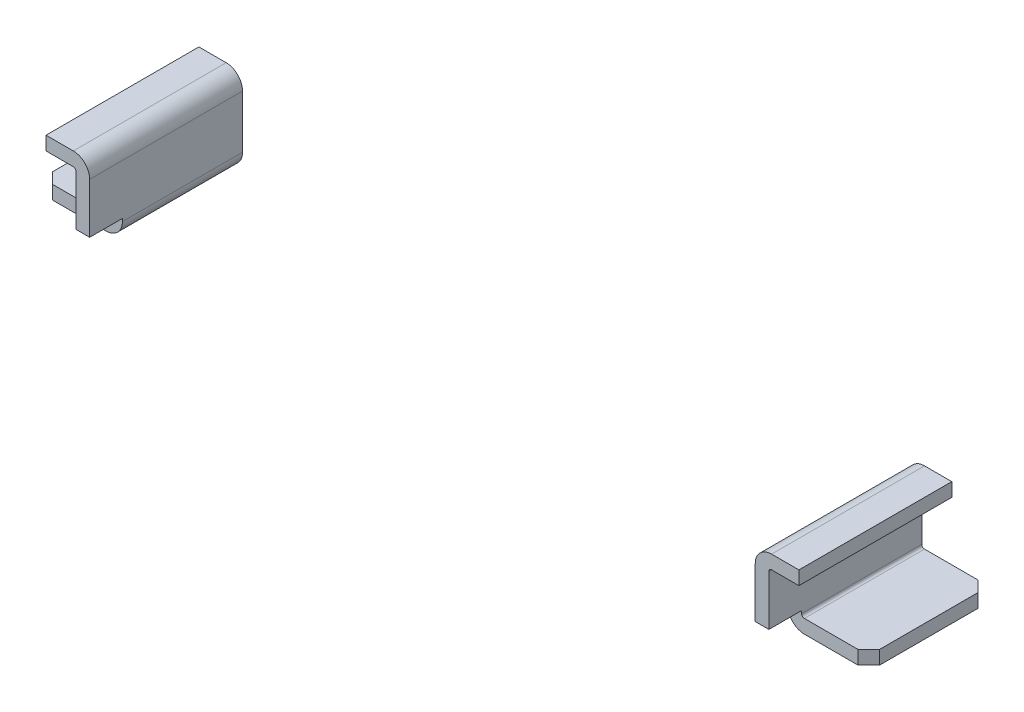
ISO-10303-21;
HEADER;
FILE_DESCRIPTION(('STEP AP214'),'2;1');
FILE_NAME('part.step','',(''),(''),'','','');
FILE_SCHEMA(('AUTOMOTIVE_DESIGN { 1 0 10303 214 1 1 1 1 }'));
ENDSEC;
DATA;
#1=APPLICATION_CONTEXT('core data for automotive mechanical design processes');
#2=APPLICATION_PROTOCOL_DEFINITION('international standard','automotive_design',2000,#1);
#3=PRODUCT_CONTEXT('',#1,'mechanical');
#4=PRODUCT('Part','Part','',(#3));
#5=PRODUCT_RELATED_PRODUCT_CATEGORY('part','',(#4));
#6=PRODUCT_DEFINITION_FORMATION('','',#4);
#7=PRODUCT_DEFINITION_CONTEXT('part definition',#1,'design');
#8=PRODUCT_DEFINITION('design','',#6,#7);
#9=PRODUCT_DEFINITION_SHAPE('','',#8);
#10=(LENGTH_UNIT() NAMED_UNIT(*) SI_UNIT(.MILLI.,.METRE.));
#11=(NAMED_UNIT(*) PLANE_ANGLE_UNIT() SI_UNIT($,.RADIAN.));
#12=(NAMED_UNIT(*) SI_UNIT($,.STERADIAN.) SOLID_ANGLE_UNIT());
#13=UNCERTAINTY_MEASURE_WITH_UNIT(LENGTH_MEASURE(1.E-05),#10,'distance_accuracy_value','');
#14=(GEOMETRIC_REPRESENTATION_CONTEXT(3) GLOBAL_UNCERTAINTY_ASSIGNED_CONTEXT((#13)) GLOBAL_UNIT_ASSIGNED_CONTEXT((#10,
#11,#12)) REPRESENTATION_CONTEXT('',''));
#15=CARTESIAN_POINT('',(0.,0.,0.));
#16=DIRECTION('',(0.,0.,1.));
#17=DIRECTION('',(1.,0.,0.));
#18=AXIS2_PLACEMENT_3D('',#15,#16,#17);
#19=CARTESIAN_POINT('',(-6.345,-3.425,-1.6));
#20=DIRECTION('',(-1.,0.,0.));
#21=DIRECTION('',(0.,0.,1.));
#22=AXIS2_PLACEMENT_3D('',#19,#20,#21);
#23=PLANE('',#22);
#24=DIRECTION('',(0.,0.,1.));
#25=VECTOR('',#24,1.);
#26=CARTESIAN_POINT('',(-6.345,-3.375,-1.6));
#27=LINE('',#26,#25);
#28=CARTESIAN_POINT('',(-6.345,-3.375,0.6));
#29=VERTEX_POINT('',#28);
#30=CARTESIAN_POINT('',(-6.345,-3.375,1.2));
#31=VERTEX_POINT('',#30);
#32=EDGE_CURVE('P0_E287',#29,#31,#27,.T.);
#33=ORIENTED_EDGE('',*,*,#32,.T.);
#34=DIRECTION('',(0.,1.,0.));
#35=VECTOR('',#34,1.);
#36=CARTESIAN_POINT('',(-6.345,-3.425,1.2));
#37=LINE('',#36,#35);
#38=CARTESIAN_POINT('',(-6.345,-2.455,1.2));
#39=VERTEX_POINT('',#38);
#40=EDGE_CURVE('P0_E98',#31,#39,#37,.T.);
#41=ORIENTED_EDGE('',*,*,#40,.T.);
#42=DIRECTION('',(0.,0.,-1.));
#43=VECTOR('',#42,1.);
#44=CARTESIAN_POINT('',(-6.345,-2.455,-1.6));
#45=LINE('',#44,#43);
#46=CARTESIAN_POINT('',(-6.345,-2.455,-1.6));
#47=VERTEX_POINT('',#46);
#48=EDGE_CURVE('P0_E282',#39,#47,#45,.T.);
#49=ORIENTED_EDGE('',*,*,#48,.T.);
#50=DIRECTION('',(0.,1.,0.));
#51=VECTOR('',#50,1.);
#52=CARTESIAN_POINT('',(-6.345,-3.425,-1.6));
#53=LINE('',#52,#51);
#54=CARTESIAN_POINT('',(-6.345,-3.425,-1.6));
#55=VERTEX_POINT('',#54);
#56=EDGE_CURVE('P0_E92',#47,#55,#53,.F.);
#57=ORIENTED_EDGE('',*,*,#56,.T.);
#58=DIRECTION('',(0.,0.,-1.));
#59=VECTOR('',#58,1.);
#60=CARTESIAN_POINT('',(-6.345,-3.425,-1.6));
#61=LINE('',#60,#59);
#62=CARTESIAN_POINT('',(-6.345,-3.425,0.6));
#63=VERTEX_POINT('',#62);
#64=EDGE_CURVE('P0_E278',#55,#63,#61,.F.);
#65=ORIENTED_EDGE('',*,*,#64,.T.);
#66=DIRECTION('',(0.,1.,0.));
#67=VECTOR('',#66,1.);
#68=CARTESIAN_POINT('',(-6.345,-3.425,0.6));
#69=LINE('',#68,#67);
#70=EDGE_CURVE('P0_E284',#63,#29,#69,.T.);
#71=ORIENTED_EDGE('',*,*,#70,.T.);
#72=EDGE_LOOP('',(#33,#41,#49,#57,#65,#71));
#73=FACE_BOUND('',#72,.T.);
#74=ADVANCED_FACE('P0_F17',(#73),#23,.T.);
#75=CARTESIAN_POINT('',(-6.395,-2.455,-1.6));
#76=DIRECTION('',(0.,0.,-1.));
#77=DIRECTION('',(-1.,0.,0.));
#78=AXIS2_PLACEMENT_3D('',#75,#76,#77);
#79=CYLINDRICAL_SURFACE('',#78,0.05);
#80=CARTESIAN_POINT('',(-6.395,-2.455,1.2));
#81=DIRECTION('',(0.,0.,-1.));
#82=DIRECTION('',(-1.,0.,0.));
#83=AXIS2_PLACEMENT_3D('',#80,#81,#82);
#84=CIRCLE('',#83,0.05);
#85=CARTESIAN_POINT('',(-6.395,-2.405,1.2));
#86=VERTEX_POINT('',#85);
#87=EDGE_CURVE('P0_E294',#86,#39,#84,.T.);
#88=ORIENTED_EDGE('',*,*,#87,.F.);
#89=DIRECTION('',(0.,0.,-1.));
#90=VECTOR('',#89,1.);
#91=CARTESIAN_POINT('',(-6.395,-2.405,-1.6));
#92=LINE('',#91,#90);
#93=CARTESIAN_POINT('',(-6.395,-2.405,-1.6));
#94=VERTEX_POINT('',#93);
#95=EDGE_CURVE('P0_E257',#94,#86,#92,.F.);
#96=ORIENTED_EDGE('',*,*,#95,.F.);
#97=CARTESIAN_POINT('',(-6.395,-2.455,-1.6));
#98=DIRECTION('',(0.,0.,-1.));
#99=DIRECTION('',(-1.,0.,0.));
#100=AXIS2_PLACEMENT_3D('',#97,#98,#99);
#101=CIRCLE('',#100,0.05);
#102=EDGE_CURVE('P0_E20',#47,#94,#101,.F.);
#103=ORIENTED_EDGE('',*,*,#102,.F.);
#104=ORIENTED_EDGE('',*,*,#48,.F.);
#105=EDGE_LOOP('',(#88,#96,#103,#104));
#106=FACE_BOUND('',#105,.T.);
#107=ADVANCED_FACE('P0_F313',(#106),#79,.F.);
#108=CARTESIAN_POINT('',(-6.395,-3.425,-1.6));
#109=DIRECTION('',(0.,0.,-1.));
#110=DIRECTION('',(-1.,0.,0.));
#111=AXIS2_PLACEMENT_3D('',#108,#109,#110);
#112=CYLINDRICAL_SURFACE('',#111,0.05);
#113=DIRECTION('',(0.,0.,1.));
#114=VECTOR('',#113,1.);
#115=CARTESIAN_POINT('',(-6.395,-3.475,-1.6));
#116=LINE('',#115,#114);
#117=CARTESIAN_POINT('',(-6.395,-3.475,0.6));
#118=VERTEX_POINT('',#117);
#119=CARTESIAN_POINT('',(-6.395,-3.475,-1.6));
#120=VERTEX_POINT('',#119);
#121=EDGE_CURVE('P0_E234',#118,#120,#116,.F.);
#122=ORIENTED_EDGE('',*,*,#121,.F.);
#123=CARTESIAN_POINT('',(-6.395,-3.425,0.6));
#124=DIRECTION('',(0.,0.,-1.));
#125=DIRECTION('',(-1.,0.,0.));
#126=AXIS2_PLACEMENT_3D('',#123,#124,#125);
#127=CIRCLE('',#126,0.05);
#128=EDGE_CURVE('P0_E281',#63,#118,#127,.T.);
#129=ORIENTED_EDGE('',*,*,#128,.F.);
#130=ORIENTED_EDGE('',*,*,#64,.F.);
#131=CARTESIAN_POINT('',(-6.395,-3.425,-1.6));
#132=DIRECTION('',(0.,0.,-1.));
#133=DIRECTION('',(-1.,0.,0.));
#134=AXIS2_PLACEMENT_3D('',#131,#132,#133);
#135=CIRCLE('',#134,0.05);
#136=EDGE_CURVE('P0_E263',#120,#55,#135,.F.);
#137=ORIENTED_EDGE('',*,*,#136,.F.);
#138=EDGE_LOOP('',(#122,#129,#130,#137));
#139=FACE_BOUND('',#138,.T.);
#140=ADVANCED_FACE('P0_F345',(#139),#112,.F.);
#141=CARTESIAN_POINT('',(-6.395,-2.405,-1.6));
#142=DIRECTION('',(0.,-1.,0.));
#143=DIRECTION('',(0.,0.,-1.));
#144=AXIS2_PLACEMENT_3D('',#141,#142,#143);
#145=PLANE('',#144);
#146=ORIENTED_EDGE('',*,*,#95,.T.);
#147=DIRECTION('',(1.,0.,0.));
#148=VECTOR('',#147,1.);
#149=CARTESIAN_POINT('',(-6.395,-2.405,1.2));
#150=LINE('',#149,#148);
#151=CARTESIAN_POINT('',(-6.895,-2.405,1.2));
#152=VERTEX_POINT('',#151);
#153=EDGE_CURVE('P0_E255',#86,#152,#150,.F.);
#154=ORIENTED_EDGE('',*,*,#153,.T.);
#155=DIRECTION('',(0.,0.,1.));
#156=VECTOR('',#155,1.);
#157=CARTESIAN_POINT('',(-6.895,-2.405,-1.6));
#158=LINE('',#157,#156);
#159=CARTESIAN_POINT('',(-6.895,-2.405,-1.6));
#160=VERTEX_POINT('',#159);
#161=EDGE_CURVE('P0_E233',#160,#152,#158,.T.);
#162=ORIENTED_EDGE('',*,*,#161,.F.);
#163=DIRECTION('',(1.,0.,0.));
#164=VECTOR('',#163,1.);
#165=CARTESIAN_POINT('',(-6.395,-2.405,-1.6));
#166=LINE('',#165,#164);
#167=EDGE_CURVE('P0_E260',#160,#94,#166,.T.);
#168=ORIENTED_EDGE('',*,*,#167,.T.);
#169=EDGE_LOOP('',(#146,#154,#162,#168));
#170=FACE_BOUND('',#169,.T.);
#171=ADVANCED_FACE('P0_F315',(#170),#145,.T.);
#172=CARTESIAN_POINT('',(-7.575,-3.475,-1.6));
#173=DIRECTION('',(0.,1.,0.));
#174=DIRECTION('',(0.,0.,1.));
#175=AXIS2_PLACEMENT_3D('',#172,#173,#174);
#176=PLANE('',#175);
#177=DIRECTION('',(1.,0.,0.));
#178=VECTOR('',#177,1.);
#179=CARTESIAN_POINT('',(-7.575,-3.475,0.6));
#180=LINE('',#179,#178);
#181=CARTESIAN_POINT('',(-7.375,-3.475,0.6));
#182=VERTEX_POINT('',#181);
#183=EDGE_CURVE('P0_E243',#182,#118,#180,.T.);
#184=ORIENTED_EDGE('',*,*,#183,.T.);
#185=ORIENTED_EDGE('',*,*,#121,.T.);
#186=DIRECTION('',(1.,0.,0.));
#187=VECTOR('',#186,1.);
#188=CARTESIAN_POINT('',(-7.575,-3.475,-1.6));
#189=LINE('',#188,#187);
#190=CARTESIAN_POINT('',(-7.375,-3.475,-1.6));
#191=VERTEX_POINT('',#190);
#192=EDGE_CURVE('P0_E248',#120,#191,#189,.F.);
#193=ORIENTED_EDGE('',*,*,#192,.T.);
#194=DIRECTION('',(-0.707106781186547,0.,0.707106781186548));
#195=VECTOR('',#194,1.);
#196=CARTESIAN_POINT('',(-7.375,-3.475,-1.6));
#197=LINE('',#196,#195);
#198=CARTESIAN_POINT('',(-7.575,-3.475,-1.4));
#199=VERTEX_POINT('',#198);
#200=EDGE_CURVE('P0_E244',#191,#199,#197,.T.);
#201=ORIENTED_EDGE('',*,*,#200,.T.);
#202=DIRECTION('',(0.,0.,1.));
#203=VECTOR('',#202,1.);
#204=CARTESIAN_POINT('',(-7.575,-3.475,-1.6));
#205=LINE('',#204,#203);
#206=CARTESIAN_POINT('',(-7.575,-3.475,0.4));
#207=VERTEX_POINT('',#206);
#208=EDGE_CURVE('P0_E215',#207,#199,#205,.F.);
#209=ORIENTED_EDGE('',*,*,#208,.F.);
#210=DIRECTION('',(0.707106781186547,0.,0.707106781186548));
#211=VECTOR('',#210,1.);
#212=CARTESIAN_POINT('',(-7.575,-3.475,0.4));
#213=LINE('',#212,#211);
#214=EDGE_CURVE('P0_E240',#207,#182,#213,.T.);
#215=ORIENTED_EDGE('',*,*,#214,.T.);
#216=EDGE_LOOP('',(#184,#185,#193,#201,#209,#215));
#217=FACE_BOUND('',#216,.T.);
#218=ADVANCED_FACE('P0_F340',(#217),#176,.T.);
#219=CARTESIAN_POINT('',(-6.895,-2.405,-1.6));
#220=DIRECTION('',(-1.,0.,0.));
#221=DIRECTION('',(0.,0.,1.));
#222=AXIS2_PLACEMENT_3D('',#219,#220,#221);
#223=PLANE('',#222);
#224=ORIENTED_EDGE('',*,*,#161,.T.);
#225=DIRECTION('',(0.,1.,0.));
#226=VECTOR('',#225,1.);
#227=CARTESIAN_POINT('',(-6.895,-2.405,1.2));
#228=LINE('',#227,#226);
#229=CARTESIAN_POINT('',(-6.895,-2.155,1.2));
#230=VERTEX_POINT('',#229);
#231=EDGE_CURVE('P0_E227',#152,#230,#228,.T.);
#232=ORIENTED_EDGE('',*,*,#231,.T.);
#233=DIRECTION('',(0.,0.,1.));
#234=VECTOR('',#233,1.);
#235=CARTESIAN_POINT('',(-6.895,-2.155,-1.6));
#236=LINE('',#235,#234);
#237=CARTESIAN_POINT('',(-6.895,-2.155,-1.6));
#238=VERTEX_POINT('',#237);
#239=EDGE_CURVE('P0_E199',#238,#230,#236,.T.);
#240=ORIENTED_EDGE('',*,*,#239,.F.);
#241=DIRECTION('',(0.,1.,0.));
#242=VECTOR('',#241,1.);
#243=CARTESIAN_POINT('',(-6.895,-2.405,-1.6));
#244=LINE('',#243,#242);
#245=EDGE_CURVE('P0_E230',#238,#160,#244,.F.);
#246=ORIENTED_EDGE('',*,*,#245,.T.);
#247=EDGE_LOOP('',(#224,#232,#240,#246));
#248=FACE_BOUND('',#247,.T.);
#249=ADVANCED_FACE('P0_F319',(#248),#223,.T.);
#250=CARTESIAN_POINT('',(-7.575,-3.725,-1.6));
#251=DIRECTION('',(-1.,0.,0.));
#252=DIRECTION('',(0.,0.,1.));
#253=AXIS2_PLACEMENT_3D('',#250,#251,#252);
#254=PLANE('',#253);
#255=DIRECTION('',(0.,1.,0.));
#256=VECTOR('',#255,1.);
#257=CARTESIAN_POINT('',(-7.575,-3.725,0.4));
#258=LINE('',#257,#256);
#259=CARTESIAN_POINT('',(-7.575,-3.725,0.4));
#260=VERTEX_POINT('',#259);
#261=EDGE_CURVE('P0_E186',#207,#260,#258,.F.);
#262=ORIENTED_EDGE('',*,*,#261,.F.);
#263=ORIENTED_EDGE('',*,*,#208,.T.);
#264=DIRECTION('',(0.,1.,0.));
#265=VECTOR('',#264,1.);
#266=CARTESIAN_POINT('',(-7.575,-3.725,-1.4));
#267=LINE('',#266,#265);
#268=CARTESIAN_POINT('',(-7.575,-3.725,-1.4));
#269=VERTEX_POINT('',#268);
#270=EDGE_CURVE('P0_E204',#199,#269,#267,.F.);
#271=ORIENTED_EDGE('',*,*,#270,.T.);
#272=DIRECTION('',(0.,0.,-1.));
#273=VECTOR('',#272,1.);
#274=CARTESIAN_POINT('',(-7.575,-3.725,-1.6));
#275=LINE('',#274,#273);
#276=EDGE_CURVE('P0_E185',#260,#269,#275,.T.);
#277=ORIENTED_EDGE('',*,*,#276,.F.);
#278=EDGE_LOOP('',(#262,#263,#271,#277));
#279=FACE_BOUND('',#278,.T.);
#280=ADVANCED_FACE('P0_F366',(#279),#254,.T.);
#281=CARTESIAN_POINT('',(-7.375,-3.725,-1.6));
#282=DIRECTION('',(0.707106781186548,0.,0.707106781186548));
#283=DIRECTION('',(0.707106781186548,0.,-0.707106781186548));
#284=AXIS2_PLACEMENT_3D('',#281,#282,#283);
#285=PLANE('',#284);
#286=DIRECTION('',(0.707106781186547,0.,-0.707106781186548));
#287=VECTOR('',#286,1.);
#288=CARTESIAN_POINT('',(-7.575,-3.725,-1.4));
#289=LINE('',#288,#287);
#290=CARTESIAN_POINT('',(-7.375,-3.725,-1.6));
#291=VERTEX_POINT('',#290);
#292=EDGE_CURVE('P0_E177',#269,#291,#289,.T.);
#293=ORIENTED_EDGE('',*,*,#292,.F.);
#294=ORIENTED_EDGE('',*,*,#270,.F.);
#295=ORIENTED_EDGE('',*,*,#200,.F.);
#296=DIRECTION('',(0.,1.,0.));
#297=VECTOR('',#296,1.);
#298=CARTESIAN_POINT('',(-7.375,-3.675,-1.6));
#299=LINE('',#298,#297);
#300=EDGE_CURVE('P0_E171',#291,#191,#299,.T.);
#301=ORIENTED_EDGE('',*,*,#300,.F.);
#302=EDGE_LOOP('',(#293,#294,#295,#301));
#303=FACE_BOUND('',#302,.T.);
#304=ADVANCED_FACE('P0_F367',(#303),#285,.F.);
#305=CARTESIAN_POINT('',(-6.895,-2.155,-1.6));
#306=DIRECTION('',(0.,1.,0.));
#307=DIRECTION('',(0.,0.,1.));
#308=AXIS2_PLACEMENT_3D('',#305,#306,#307);
#309=PLANE('',#308);
#310=ORIENTED_EDGE('',*,*,#239,.T.);
#311=DIRECTION('',(1.,0.,0.));
#312=VECTOR('',#311,1.);
#313=CARTESIAN_POINT('',(-6.895,-2.155,1.2));
#314=LINE('',#313,#312);
#315=CARTESIAN_POINT('',(-6.395,-2.155,1.2));
#316=VERTEX_POINT('',#315);
#317=EDGE_CURVE('P0_E197',#230,#316,#314,.T.);
#318=ORIENTED_EDGE('',*,*,#317,.T.);
#319=DIRECTION('',(0.,0.,-1.));
#320=VECTOR('',#319,1.);
#321=CARTESIAN_POINT('',(-6.395,-2.155,-1.6));
#322=LINE('',#321,#320);
#323=CARTESIAN_POINT('',(-6.395,-2.155,-1.6));
#324=VERTEX_POINT('',#323);
#325=EDGE_CURVE('P0_E194',#324,#316,#322,.F.);
#326=ORIENTED_EDGE('',*,*,#325,.F.);
#327=DIRECTION('',(-1.,0.,0.));
#328=VECTOR('',#327,1.);
#329=CARTESIAN_POINT('',(5.875,-2.155,-1.6));
#330=LINE('',#329,#328);
#331=EDGE_CURVE('P0_E168',#238,#324,#330,.F.);
#332=ORIENTED_EDGE('',*,*,#331,.F.);
#333=EDGE_LOOP('',(#310,#318,#326,#332));
#334=FACE_BOUND('',#333,.T.);
#335=ADVANCED_FACE('P0_F323',(#334),#309,.T.);
#336=CARTESIAN_POINT('',(-7.375,-3.725,0.6));
#337=DIRECTION('',(-0.707106781186548,0.,0.707106781186548));
#338=DIRECTION('',(0.707106781186548,0.,0.707106781186548));
#339=AXIS2_PLACEMENT_3D('',#336,#337,#338);
#340=PLANE('',#339);
#341=ORIENTED_EDGE('',*,*,#261,.T.);
#342=DIRECTION('',(-0.707106781186547,0.,-0.707106781186548));
#343=VECTOR('',#342,1.);
#344=CARTESIAN_POINT('',(-7.375,-3.725,0.6));
#345=LINE('',#344,#343);
#346=CARTESIAN_POINT('',(-7.375,-3.725,0.6));
#347=VERTEX_POINT('',#346);
#348=EDGE_CURVE('P0_E182',#347,#260,#345,.T.);
#349=ORIENTED_EDGE('',*,*,#348,.F.);
#350=DIRECTION('',(0.,1.,0.));
#351=VECTOR('',#350,1.);
#352=CARTESIAN_POINT('',(-7.375,-3.675,0.6));
#353=LINE('',#352,#351);
#354=EDGE_CURVE('P0_E189',#347,#182,#353,.T.);
#355=ORIENTED_EDGE('',*,*,#354,.T.);
#356=ORIENTED_EDGE('',*,*,#214,.F.);
#357=EDGE_LOOP('',(#341,#349,#355,#356));
#358=FACE_BOUND('',#357,.T.);
#359=ADVANCED_FACE('P0_F361',(#358),#340,.T.);
#360=CARTESIAN_POINT('',(-6.395,-3.725,-1.6));
#361=DIRECTION('',(0.,-1.,0.));
#362=DIRECTION('',(0.,0.,-1.));
#363=AXIS2_PLACEMENT_3D('',#360,#361,#362);
#364=PLANE('',#363);
#365=ORIENTED_EDGE('',*,*,#276,.T.);
#366=ORIENTED_EDGE('',*,*,#292,.T.);
#367=DIRECTION('',(-1.,0.,0.));
#368=VECTOR('',#367,1.);
#369=CARTESIAN_POINT('',(5.875,-3.725,-1.6));
#370=LINE('',#369,#368);
#371=CARTESIAN_POINT('',(-6.395,-3.725,-1.6));
#372=VERTEX_POINT('',#371);
#373=EDGE_CURVE('P0_E174',#372,#291,#370,.T.);
#374=ORIENTED_EDGE('',*,*,#373,.F.);
#375=DIRECTION('',(0.,0.,-1.));
#376=VECTOR('',#375,1.);
#377=CARTESIAN_POINT('',(-6.395,-3.725,-1.6));
#378=LINE('',#377,#376);
#379=CARTESIAN_POINT('',(-6.395,-3.725,0.6));
#380=VERTEX_POINT('',#379);
#381=EDGE_CURVE('P0_E167',#380,#372,#378,.T.);
#382=ORIENTED_EDGE('',*,*,#381,.F.);
#383=DIRECTION('',(-1.,0.,0.));
#384=VECTOR('',#383,1.);
#385=CARTESIAN_POINT('',(5.875,-3.725,0.6));
#386=LINE('',#385,#384);
#387=EDGE_CURVE('P0_E143',#380,#347,#386,.T.);
#388=ORIENTED_EDGE('',*,*,#387,.T.);
#389=ORIENTED_EDGE('',*,*,#348,.T.);
#390=EDGE_LOOP('',(#365,#366,#374,#382,#388,#389));
#391=FACE_BOUND('',#390,.T.);
#392=ADVANCED_FACE('P0_F333',(#391),#364,.T.);
#393=CARTESIAN_POINT('',(5.875,-3.675,-1.6));
#394=DIRECTION('',(0.,0.,-1.));
#395=DIRECTION('',(-1.,0.,0.));
#396=AXIS2_PLACEMENT_3D('',#393,#394,#395);
#397=PLANE('',#396);
#398=ORIENTED_EDGE('',*,*,#331,.T.);
#399=CARTESIAN_POINT('',(-6.395,-2.455,-1.6));
#400=DIRECTION('',(0.,0.,-1.));
#401=DIRECTION('',(-1.,0.,0.));
#402=AXIS2_PLACEMENT_3D('',#399,#400,#401);
#403=CIRCLE('',#402,0.3);
#404=CARTESIAN_POINT('',(-6.095,-2.455,-1.6));
#405=VERTEX_POINT('',#404);
#406=EDGE_CURVE('P0_E170',#405,#324,#403,.F.);
#407=ORIENTED_EDGE('',*,*,#406,.F.);
#408=DIRECTION('',(0.,1.,0.));
#409=VECTOR('',#408,1.);
#410=CARTESIAN_POINT('',(-6.095,-2.455,-1.6));
#411=LINE('',#410,#409);
#412=CARTESIAN_POINT('',(-6.095,-3.425,-1.6));
#413=VERTEX_POINT('',#412);
#414=EDGE_CURVE('P0_E159',#413,#405,#411,.T.);
#415=ORIENTED_EDGE('',*,*,#414,.F.);
#416=CARTESIAN_POINT('',(-6.395,-3.425,-1.6));
#417=DIRECTION('',(0.,0.,-1.));
#418=DIRECTION('',(-1.,0.,0.));
#419=AXIS2_PLACEMENT_3D('',#416,#417,#418);
#420=CIRCLE('',#419,0.3);
#421=EDGE_CURVE('P0_E299',#372,#413,#420,.F.);
#422=ORIENTED_EDGE('',*,*,#421,.F.);
#423=ORIENTED_EDGE('',*,*,#373,.T.);
#424=ORIENTED_EDGE('',*,*,#300,.T.);
#425=ORIENTED_EDGE('',*,*,#192,.F.);
#426=ORIENTED_EDGE('',*,*,#136,.T.);
#427=ORIENTED_EDGE('',*,*,#56,.F.);
#428=ORIENTED_EDGE('',*,*,#102,.T.);
#429=ORIENTED_EDGE('',*,*,#167,.F.);
#430=ORIENTED_EDGE('',*,*,#245,.F.);
#431=EDGE_LOOP('',(#398,#407,#415,#422,#423,#424,#425,#426,#427,#428,#429,#430));
#432=FACE_BOUND('',#431,.T.);
#433=ADVANCED_FACE('P0_F309',(#432),#397,.T.);
#434=CARTESIAN_POINT('',(-6.395,-2.455,-1.6));
#435=DIRECTION('',(0.,0.,-1.));
#436=DIRECTION('',(-1.,0.,0.));
#437=AXIS2_PLACEMENT_3D('',#434,#435,#436);
#438=CYLINDRICAL_SURFACE('',#437,0.3);
#439=ORIENTED_EDGE('',*,*,#325,.T.);
#440=CARTESIAN_POINT('',(-6.395,-2.455,1.2));
#441=DIRECTION('',(0.,0.,-1.));
#442=DIRECTION('',(-1.,0.,0.));
#443=AXIS2_PLACEMENT_3D('',#440,#441,#442);
#444=CIRCLE('',#443,0.3);
#445=CARTESIAN_POINT('',(-6.095,-2.455,1.2));
#446=VERTEX_POINT('',#445);
#447=EDGE_CURVE('P0_E144',#316,#446,#444,.T.);
#448=ORIENTED_EDGE('',*,*,#447,.T.);
#449=DIRECTION('',(0.,0.,-1.));
#450=VECTOR('',#449,1.);
#451=CARTESIAN_POINT('',(-6.095,-2.455,-1.6));
#452=LINE('',#451,#450);
#453=EDGE_CURVE('P0_E157',#405,#446,#452,.F.);
#454=ORIENTED_EDGE('',*,*,#453,.F.);
#455=ORIENTED_EDGE('',*,*,#406,.T.);
#456=EDGE_LOOP('',(#439,#448,#454,#455));
#457=FACE_BOUND('',#456,.T.);
#458=ADVANCED_FACE('P0_F326',(#457),#438,.T.);
#459=CARTESIAN_POINT('',(5.875,-3.675,1.2));
#460=DIRECTION('',(0.,0.,-1.));
#461=DIRECTION('',(-1.,0.,0.));
#462=AXIS2_PLACEMENT_3D('',#459,#460,#461);
#463=PLANE('',#462);
#464=DIRECTION('',(1.,0.,0.));
#465=VECTOR('',#464,1.);
#466=CARTESIAN_POINT('',(-5.875,-3.375,1.2));
#467=LINE('',#466,#465);
#468=CARTESIAN_POINT('',(-6.095,-3.375,1.2));
#469=VERTEX_POINT('',#468);
#470=EDGE_CURVE('P0_E134',#469,#31,#467,.F.);
#471=ORIENTED_EDGE('',*,*,#470,.F.);
#472=DIRECTION('',(0.,1.,0.));
#473=VECTOR('',#472,1.);
#474=CARTESIAN_POINT('',(-6.095,-2.455,1.2));
#475=LINE('',#474,#473);
#476=EDGE_CURVE('P0_E139',#446,#469,#475,.F.);
#477=ORIENTED_EDGE('',*,*,#476,.F.);
#478=ORIENTED_EDGE('',*,*,#447,.F.);
#479=ORIENTED_EDGE('',*,*,#317,.F.);
#480=ORIENTED_EDGE('',*,*,#231,.F.);
#481=ORIENTED_EDGE('',*,*,#153,.F.);
#482=ORIENTED_EDGE('',*,*,#87,.T.);
#483=ORIENTED_EDGE('',*,*,#40,.F.);
#484=EDGE_LOOP('',(#471,#477,#478,#479,#480,#481,#482,#483));
#485=FACE_BOUND('',#484,.T.);
#486=ADVANCED_FACE('P0_F136',(#485),#463,.F.);
#487=CARTESIAN_POINT('',(-5.875,-3.375,-1.6));
#488=DIRECTION('',(0.,-1.,0.));
#489=DIRECTION('',(0.,0.,-1.));
#490=AXIS2_PLACEMENT_3D('',#487,#488,#489);
#491=PLANE('',#490);
#492=DIRECTION('',(0.,0.,-1.));
#493=VECTOR('',#492,1.);
#494=CARTESIAN_POINT('',(-6.095,-3.375,-1.6));
#495=LINE('',#494,#493);
#496=CARTESIAN_POINT('',(-6.095,-3.375,0.6));
#497=VERTEX_POINT('',#496);
#498=EDGE_CURVE('P0_E147',#469,#497,#495,.T.);
#499=ORIENTED_EDGE('',*,*,#498,.F.);
#500=ORIENTED_EDGE('',*,*,#470,.T.);
#501=ORIENTED_EDGE('',*,*,#32,.F.);
#502=DIRECTION('',(-1.,0.,0.));
#503=VECTOR('',#502,1.);
#504=CARTESIAN_POINT('',(5.875,-3.375,0.6));
#505=LINE('',#504,#503);
#506=EDGE_CURVE('P0_E150',#29,#497,#505,.F.);
#507=ORIENTED_EDGE('',*,*,#506,.T.);
#508=EDGE_LOOP('',(#499,#500,#501,#507));
#509=FACE_BOUND('',#508,.T.);
#510=ADVANCED_FACE('P0_F148',(#509),#491,.T.);
#511=CARTESIAN_POINT('',(5.875,-3.675,0.6));
#512=DIRECTION('',(0.,0.,-1.));
#513=DIRECTION('',(-1.,0.,0.));
#514=AXIS2_PLACEMENT_3D('',#511,#512,#513);
#515=PLANE('',#514);
#516=ORIENTED_EDGE('',*,*,#70,.F.);
#517=ORIENTED_EDGE('',*,*,#128,.T.);
#518=ORIENTED_EDGE('',*,*,#183,.F.);
#519=ORIENTED_EDGE('',*,*,#354,.F.);
#520=ORIENTED_EDGE('',*,*,#387,.F.);
#521=CARTESIAN_POINT('',(-6.395,-3.425,0.6));
#522=DIRECTION('',(0.,0.,-1.));
#523=DIRECTION('',(-1.,0.,0.));
#524=AXIS2_PLACEMENT_3D('',#521,#522,#523);
#525=CIRCLE('',#524,0.3);
#526=CARTESIAN_POINT('',(-6.095,-3.425,0.6));
#527=VERTEX_POINT('',#526);
#528=EDGE_CURVE('P0_E35',#527,#380,#525,.T.);
#529=ORIENTED_EDGE('',*,*,#528,.F.);
#530=DIRECTION('',(0.,1.,0.));
#531=VECTOR('',#530,1.);
#532=CARTESIAN_POINT('',(-6.095,-2.455,0.6));
#533=LINE('',#532,#531);
#534=EDGE_CURVE('P0_E26',#497,#527,#533,.F.);
#535=ORIENTED_EDGE('',*,*,#534,.F.);
#536=ORIENTED_EDGE('',*,*,#506,.F.);
#537=EDGE_LOOP('',(#516,#517,#518,#519,#520,#529,#535,#536));
#538=FACE_BOUND('',#537,.T.);
#539=ADVANCED_FACE('P0_F348',(#538),#515,.F.);
#540=CARTESIAN_POINT('',(-6.395,-3.425,-1.6));
#541=DIRECTION('',(0.,0.,-1.));
#542=DIRECTION('',(-1.,0.,0.));
#543=AXIS2_PLACEMENT_3D('',#540,#541,#542);
#544=CYLINDRICAL_SURFACE('',#543,0.3);
#545=ORIENTED_EDGE('',*,*,#528,.T.);
#546=ORIENTED_EDGE('',*,*,#381,.T.);
#547=ORIENTED_EDGE('',*,*,#421,.T.);
#548=DIRECTION('',(0.,0.,-1.));
#549=VECTOR('',#548,1.);
#550=CARTESIAN_POINT('',(-6.095,-3.425,-1.6));
#551=LINE('',#550,#549);
#552=EDGE_CURVE('P0_E11',#527,#413,#551,.T.);
#553=ORIENTED_EDGE('',*,*,#552,.F.);
#554=EDGE_LOOP('',(#545,#546,#547,#553));
#555=FACE_BOUND('',#554,.T.);
#556=ADVANCED_FACE('P0_F329',(#555),#544,.T.);
#557=CARTESIAN_POINT('',(-6.095,-2.455,-1.6));
#558=DIRECTION('',(1.,0.,0.));
#559=DIRECTION('',(0.,0.,-1.));
#560=AXIS2_PLACEMENT_3D('',#557,#558,#559);
#561=PLANE('',#560);
#562=ORIENTED_EDGE('',*,*,#534,.T.);
#563=ORIENTED_EDGE('',*,*,#552,.T.);
#564=ORIENTED_EDGE('',*,*,#414,.T.);
#565=ORIENTED_EDGE('',*,*,#453,.T.);
#566=ORIENTED_EDGE('',*,*,#476,.T.);
#567=ORIENTED_EDGE('',*,*,#498,.T.);
#568=EDGE_LOOP('',(#562,#563,#564,#565,#566,#567));
#569=FACE_BOUND('',#568,.T.);
#570=ADVANCED_FACE('P0_F154',(#569),#561,.T.);
#571=CLOSED_SHELL('',(#74,#107,#140,#171,#218,#249,#280,#304,#335,#359,#392,#433,#458,#486,#510,
#539,#556,#570));
#572=MANIFOLD_SOLID_BREP('P0_B1',#571);
#573=CARTESIAN_POINT('',(6.095,-3.425,-1.6));
#574=DIRECTION('',(-1.,0.,0.));
#575=DIRECTION('',(0.,0.,1.));
#576=AXIS2_PLACEMENT_3D('',#573,#574,#575);
#577=PLANE('',#576);
#578=DIRECTION('',(0.,1.,0.));
#579=VECTOR('',#578,1.);
#580=CARTESIAN_POINT('',(6.095,-3.425,1.2));
#581=LINE('',#580,#579);
#582=CARTESIAN_POINT('',(6.095,-3.375,1.2));
#583=VERTEX_POINT('',#582);
#584=CARTESIAN_POINT('',(6.095,-2.455,1.2));
#585=VERTEX_POINT('',#584);
#586=EDGE_CURVE('P1_E99',#583,#585,#581,.T.);
#587=ORIENTED_EDGE('',*,*,#586,.T.);
#588=DIRECTION('',(0.,0.,-1.));
#589=VECTOR('',#588,1.);
#590=CARTESIAN_POINT('',(6.095,-2.455,-1.6));
#591=LINE('',#590,#589);
#592=CARTESIAN_POINT('',(6.095,-2.455,-1.6));
#593=VERTEX_POINT('',#592);
#594=EDGE_CURVE('P1_E98',#593,#585,#591,.F.);
#595=ORIENTED_EDGE('',*,*,#594,.F.);
#596=DIRECTION('',(0.,1.,0.));
#597=VECTOR('',#596,1.);
#598=CARTESIAN_POINT('',(6.095,-3.425,-1.6));
#599=LINE('',#598,#597);
#600=CARTESIAN_POINT('',(6.095,-3.425,-1.6));
#601=VERTEX_POINT('',#600);
#602=EDGE_CURVE('P1_E94',#593,#601,#599,.F.);
#603=ORIENTED_EDGE('',*,*,#602,.T.);
#604=DIRECTION('',(0.,0.,-1.));
#605=VECTOR('',#604,1.);
#606=CARTESIAN_POINT('',(6.095,-3.425,-1.6));
#607=LINE('',#606,#605);
#608=CARTESIAN_POINT('',(6.095,-3.425,0.6));
#609=VERTEX_POINT('',#608);
#610=EDGE_CURVE('P1_E114',#609,#601,#607,.T.);
#611=ORIENTED_EDGE('',*,*,#610,.F.);
#612=DIRECTION('',(0.,1.,0.));
#613=VECTOR('',#612,1.);
#614=CARTESIAN_POINT('',(6.095,-3.425,0.6));
#615=LINE('',#614,#613);
#616=CARTESIAN_POINT('',(6.095,-3.375,0.6));
#617=VERTEX_POINT('',#616);
#618=EDGE_CURVE('P1_E141',#609,#617,#615,.T.);
#619=ORIENTED_EDGE('',*,*,#618,.T.);
#620=DIRECTION('',(0.,0.,1.));
#621=VECTOR('',#620,1.);
#622=CARTESIAN_POINT('',(6.095,-3.375,-1.6));
#623=LINE('',#622,#621);
#624=EDGE_CURVE('P1_E144',#617,#583,#623,.T.);
#625=ORIENTED_EDGE('',*,*,#624,.T.);
#626=EDGE_LOOP('',(#587,#595,#603,#611,#619,#625));
#627=FACE_BOUND('',#626,.T.);
#628=ADVANCED_FACE('P1_F17',(#627),#577,.T.);
#629=CARTESIAN_POINT('',(6.395,-2.455,-1.6));
#630=DIRECTION('',(0.,0.,-1.));
#631=DIRECTION('',(-1.,0.,0.));
#632=AXIS2_PLACEMENT_3D('',#629,#630,#631);
#633=CYLINDRICAL_SURFACE('',#632,0.3);
#634=ORIENTED_EDGE('',*,*,#594,.T.);
#635=CARTESIAN_POINT('',(6.395,-2.455,1.2));
#636=DIRECTION('',(0.,0.,-1.));
#637=DIRECTION('',(-1.,0.,0.));
#638=AXIS2_PLACEMENT_3D('',#635,#636,#637);
#639=CIRCLE('',#638,0.3);
#640=CARTESIAN_POINT('',(6.395,-2.155,1.2));
#641=VERTEX_POINT('',#640);
#642=EDGE_CURVE('P1_E104',#585,#641,#639,.T.);
#643=ORIENTED_EDGE('',*,*,#642,.T.);
#644=DIRECTION('',(0.,0.,1.));
#645=VECTOR('',#644,1.);
#646=CARTESIAN_POINT('',(6.395,-2.155,-1.6));
#647=LINE('',#646,#645);
#648=CARTESIAN_POINT('',(6.395,-2.155,-1.6));
#649=VERTEX_POINT('',#648);
#650=EDGE_CURVE('P1_E101',#649,#641,#647,.T.);
#651=ORIENTED_EDGE('',*,*,#650,.F.);
#652=CARTESIAN_POINT('',(6.395,-2.455,-1.6));
#653=DIRECTION('',(0.,0.,-1.));
#654=DIRECTION('',(-1.,0.,0.));
#655=AXIS2_PLACEMENT_3D('',#652,#653,#654);
#656=CIRCLE('',#655,0.3);
#657=EDGE_CURVE('P1_E20',#649,#593,#656,.F.);
#658=ORIENTED_EDGE('',*,*,#657,.T.);
#659=EDGE_LOOP('',(#634,#643,#651,#658));
#660=FACE_BOUND('',#659,.T.);
#661=ADVANCED_FACE('P1_F102',(#660),#633,.T.);
#662=CARTESIAN_POINT('',(6.395,-3.425,-1.6));
#663=DIRECTION('',(0.,0.,-1.));
#664=DIRECTION('',(-1.,0.,0.));
#665=AXIS2_PLACEMENT_3D('',#662,#663,#664);
#666=CYLINDRICAL_SURFACE('',#665,0.3);
#667=CARTESIAN_POINT('',(6.395,-3.425,0.6));
#668=DIRECTION('',(0.,0.,-1.));
#669=DIRECTION('',(-1.,0.,0.));
#670=AXIS2_PLACEMENT_3D('',#667,#668,#669);
#671=CIRCLE('',#670,0.3);
#672=CARTESIAN_POINT('',(6.395,-3.725,0.6));
#673=VERTEX_POINT('',#672);
#674=EDGE_CURVE('P1_E117',#673,#609,#671,.T.);
#675=ORIENTED_EDGE('',*,*,#674,.T.);
#676=ORIENTED_EDGE('',*,*,#610,.T.);
#677=CARTESIAN_POINT('',(6.395,-3.425,-1.6));
#678=DIRECTION('',(0.,0.,-1.));
#679=DIRECTION('',(-1.,0.,0.));
#680=AXIS2_PLACEMENT_3D('',#677,#678,#679);
#681=CIRCLE('',#680,0.3);
#682=CARTESIAN_POINT('',(6.395,-3.725,-1.6));
#683=VERTEX_POINT('',#682);
#684=EDGE_CURVE('P1_E171',#601,#683,#681,.F.);
#685=ORIENTED_EDGE('',*,*,#684,.T.);
#686=DIRECTION('',(0.,0.,-1.));
#687=VECTOR('',#686,1.);
#688=CARTESIAN_POINT('',(6.395,-3.725,-1.6));
#689=LINE('',#688,#687);
#690=EDGE_CURVE('P1_E125',#673,#683,#689,.T.);
#691=ORIENTED_EDGE('',*,*,#690,.F.);
#692=EDGE_LOOP('',(#675,#676,#685,#691));
#693=FACE_BOUND('',#692,.T.);
#694=ADVANCED_FACE('P1_F175',(#693),#666,.T.);
#695=CARTESIAN_POINT('',(6.395,-2.155,-1.6));
#696=DIRECTION('',(0.,1.,0.));
#697=DIRECTION('',(0.,0.,1.));
#698=AXIS2_PLACEMENT_3D('',#695,#696,#697);
#699=PLANE('',#698);
#700=ORIENTED_EDGE('',*,*,#650,.T.);
#701=DIRECTION('',(1.,0.,0.));
#702=VECTOR('',#701,1.);
#703=CARTESIAN_POINT('',(6.395,-2.155,1.2));
#704=LINE('',#703,#702);
#705=CARTESIAN_POINT('',(6.895,-2.155,1.2));
#706=VERTEX_POINT('',#705);
#707=EDGE_CURVE('P1_E108',#641,#706,#704,.T.);
#708=ORIENTED_EDGE('',*,*,#707,.T.);
#709=DIRECTION('',(0.,0.,-1.));
#710=VECTOR('',#709,1.);
#711=CARTESIAN_POINT('',(6.895,-2.155,-1.6));
#712=LINE('',#711,#710);
#713=CARTESIAN_POINT('',(6.895,-2.155,-1.6));
#714=VERTEX_POINT('',#713);
#715=EDGE_CURVE('P1_E112',#714,#706,#712,.F.);
#716=ORIENTED_EDGE('',*,*,#715,.F.);
#717=DIRECTION('',(1.,0.,0.));
#718=VECTOR('',#717,1.);
#719=CARTESIAN_POINT('',(6.395,-2.155,-1.6));
#720=LINE('',#719,#718);
#721=EDGE_CURVE('P1_E91',#714,#649,#720,.F.);
#722=ORIENTED_EDGE('',*,*,#721,.T.);
#723=EDGE_LOOP('',(#700,#708,#716,#722));
#724=FACE_BOUND('',#723,.T.);
#725=ADVANCED_FACE('P1_F110',(#724),#699,.T.);
#726=CARTESIAN_POINT('',(7.575,-3.725,-1.6));
#727=DIRECTION('',(0.,-1.,0.));
#728=DIRECTION('',(0.,0.,-1.));
#729=AXIS2_PLACEMENT_3D('',#726,#727,#728);
#730=PLANE('',#729);
#731=DIRECTION('',(1.,0.,0.));
#732=VECTOR('',#731,1.);
#733=CARTESIAN_POINT('',(7.575,-3.725,0.6));
#734=LINE('',#733,#732);
#735=CARTESIAN_POINT('',(7.375,-3.725,0.6));
#736=VERTEX_POINT('',#735);
#737=EDGE_CURVE('P1_E129',#736,#673,#734,.F.);
#738=ORIENTED_EDGE('',*,*,#737,.T.);
#739=ORIENTED_EDGE('',*,*,#690,.T.);
#740=DIRECTION('',(1.,0.,0.));
#741=VECTOR('',#740,1.);
#742=CARTESIAN_POINT('',(7.575,-3.725,-1.6));
#743=LINE('',#742,#741);
#744=CARTESIAN_POINT('',(7.375,-3.725,-1.6));
#745=VERTEX_POINT('',#744);
#746=EDGE_CURVE('P1_E135',#683,#745,#743,.T.);
#747=ORIENTED_EDGE('',*,*,#746,.T.);
#748=DIRECTION('',(0.707106781186547,0.,0.707106781186548));
#749=VECTOR('',#748,1.);
#750=CARTESIAN_POINT('',(7.375,-3.725,-1.6));
#751=LINE('',#750,#749);
#752=CARTESIAN_POINT('',(7.575,-3.725,-1.4));
#753=VERTEX_POINT('',#752);
#754=EDGE_CURVE('P1_E138',#745,#753,#751,.T.);
#755=ORIENTED_EDGE('',*,*,#754,.T.);
#756=DIRECTION('',(0.,0.,-1.));
#757=VECTOR('',#756,1.);
#758=CARTESIAN_POINT('',(7.575,-3.725,-1.6));
#759=LINE('',#758,#757);
#760=CARTESIAN_POINT('',(7.575,-3.725,0.4));
#761=VERTEX_POINT('',#760);
#762=EDGE_CURVE('P1_E220',#761,#753,#759,.T.);
#763=ORIENTED_EDGE('',*,*,#762,.F.);
#764=DIRECTION('',(-0.707106781186547,0.,0.707106781186548));
#765=VECTOR('',#764,1.);
#766=CARTESIAN_POINT('',(7.575,-3.725,0.4));
#767=LINE('',#766,#765);
#768=EDGE_CURVE('P1_E132',#761,#736,#767,.T.);
#769=ORIENTED_EDGE('',*,*,#768,.T.);
#770=EDGE_LOOP('',(#738,#739,#747,#755,#763,#769));
#771=FACE_BOUND('',#770,.T.);
#772=ADVANCED_FACE('P1_F178',(#771),#730,.T.);
#773=CARTESIAN_POINT('',(6.895,-2.155,-1.6));
#774=DIRECTION('',(1.,0.,0.));
#775=DIRECTION('',(0.,0.,-1.));
#776=AXIS2_PLACEMENT_3D('',#773,#774,#775);
#777=PLANE('',#776);
#778=ORIENTED_EDGE('',*,*,#715,.T.);
#779=DIRECTION('',(0.,1.,0.));
#780=VECTOR('',#779,1.);
#781=CARTESIAN_POINT('',(6.895,-2.155,1.2));
#782=LINE('',#781,#780);
#783=CARTESIAN_POINT('',(6.895,-2.405,1.2));
#784=VERTEX_POINT('',#783);
#785=EDGE_CURVE('P1_E250',#706,#784,#782,.F.);
#786=ORIENTED_EDGE('',*,*,#785,.T.);
#787=DIRECTION('',(0.,0.,-1.));
#788=VECTOR('',#787,1.);
#789=CARTESIAN_POINT('',(6.895,-2.405,-1.6));
#790=LINE('',#789,#788);
#791=CARTESIAN_POINT('',(6.895,-2.405,-1.6));
#792=VERTEX_POINT('',#791);
#793=EDGE_CURVE('P1_E214',#792,#784,#790,.F.);
#794=ORIENTED_EDGE('',*,*,#793,.F.);
#795=DIRECTION('',(0.,1.,0.));
#796=VECTOR('',#795,1.);
#797=CARTESIAN_POINT('',(6.895,-2.155,-1.6));
#798=LINE('',#797,#796);
#799=EDGE_CURVE('P1_E128',#792,#714,#798,.T.);
#800=ORIENTED_EDGE('',*,*,#799,.T.);
#801=EDGE_LOOP('',(#778,#786,#794,#800));
#802=FACE_BOUND('',#801,.T.);
#803=ADVANCED_FACE('P1_F281',(#802),#777,.T.);
#804=CARTESIAN_POINT('',(7.575,-3.475,-1.6));
#805=DIRECTION('',(1.,0.,0.));
#806=DIRECTION('',(0.,0.,-1.));
#807=AXIS2_PLACEMENT_3D('',#804,#805,#806);
#808=PLANE('',#807);
#809=DIRECTION('',(0.,1.,0.));
#810=VECTOR('',#809,1.);
#811=CARTESIAN_POINT('',(7.575,-3.475,0.4));
#812=LINE('',#811,#810);
#813=CARTESIAN_POINT('',(7.575,-3.475,0.4));
#814=VERTEX_POINT('',#813);
#815=EDGE_CURVE('P1_E213',#761,#814,#812,.T.);
#816=ORIENTED_EDGE('',*,*,#815,.F.);
#817=ORIENTED_EDGE('',*,*,#762,.T.);
#818=DIRECTION('',(0.,1.,0.));
#819=VECTOR('',#818,1.);
#820=CARTESIAN_POINT('',(7.575,-3.475,-1.4));
#821=LINE('',#820,#819);
#822=CARTESIAN_POINT('',(7.575,-3.475,-1.4));
#823=VERTEX_POINT('',#822);
#824=EDGE_CURVE('P1_E243',#753,#823,#821,.T.);
#825=ORIENTED_EDGE('',*,*,#824,.T.);
#826=DIRECTION('',(0.,0.,1.));
#827=VECTOR('',#826,1.);
#828=CARTESIAN_POINT('',(7.575,-3.475,-1.6));
#829=LINE('',#828,#827);
#830=EDGE_CURVE('P1_E227',#814,#823,#829,.F.);
#831=ORIENTED_EDGE('',*,*,#830,.F.);
#832=EDGE_LOOP('',(#816,#817,#825,#831));
#833=FACE_BOUND('',#832,.T.);
#834=ADVANCED_FACE('P1_F310',(#833),#808,.T.);
#835=CARTESIAN_POINT('',(6.895,-2.405,-1.6));
#836=DIRECTION('',(0.,-1.,0.));
#837=DIRECTION('',(0.,0.,-1.));
#838=AXIS2_PLACEMENT_3D('',#835,#836,#837);
#839=PLANE('',#838);
#840=ORIENTED_EDGE('',*,*,#793,.T.);
#841=DIRECTION('',(1.,0.,0.));
#842=VECTOR('',#841,1.);
#843=CARTESIAN_POINT('',(6.895,-2.405,1.2));
#844=LINE('',#843,#842);
#845=CARTESIAN_POINT('',(6.395,-2.405,1.2));
#846=VERTEX_POINT('',#845);
#847=EDGE_CURVE('P1_E211',#784,#846,#844,.F.);
#848=ORIENTED_EDGE('',*,*,#847,.T.);
#849=DIRECTION('',(0.,0.,-1.));
#850=VECTOR('',#849,1.);
#851=CARTESIAN_POINT('',(6.395,-2.405,-1.6));
#852=LINE('',#851,#850);
#853=CARTESIAN_POINT('',(6.395,-2.405,-1.6));
#854=VERTEX_POINT('',#853);
#855=EDGE_CURVE('P1_E168',#846,#854,#852,.T.);
#856=ORIENTED_EDGE('',*,*,#855,.T.);
#857=DIRECTION('',(1.,0.,0.));
#858=VECTOR('',#857,1.);
#859=CARTESIAN_POINT('',(6.895,-2.405,-1.6));
#860=LINE('',#859,#858);
#861=EDGE_CURVE('P1_E217',#854,#792,#860,.T.);
#862=ORIENTED_EDGE('',*,*,#861,.T.);
#863=EDGE_LOOP('',(#840,#848,#856,#862));
#864=FACE_BOUND('',#863,.T.);
#865=ADVANCED_FACE('P1_F410',(#864),#839,.T.);
#866=CARTESIAN_POINT('',(7.375,-3.475,0.6));
#867=DIRECTION('',(0.707106781186548,0.,0.707106781186548));
#868=DIRECTION('',(0.707106781186548,0.,-0.707106781186548));
#869=AXIS2_PLACEMENT_3D('',#866,#867,#868);
#870=PLANE('',#869);
#871=ORIENTED_EDGE('',*,*,#815,.T.);
#872=DIRECTION('',(0.707106781186547,0.,-0.707106781186548));
#873=VECTOR('',#872,1.);
#874=CARTESIAN_POINT('',(7.375,-3.475,0.6));
#875=LINE('',#874,#873);
#876=CARTESIAN_POINT('',(7.375,-3.475,0.6));
#877=VERTEX_POINT('',#876);
#878=EDGE_CURVE('P1_E197',#877,#814,#875,.T.);
#879=ORIENTED_EDGE('',*,*,#878,.F.);
#880=DIRECTION('',(0.,1.,0.));
#881=VECTOR('',#880,1.);
#882=CARTESIAN_POINT('',(7.375,-3.675,0.6));
#883=LINE('',#882,#881);
#884=EDGE_CURVE('P1_E189',#877,#736,#883,.F.);
#885=ORIENTED_EDGE('',*,*,#884,.T.);
#886=ORIENTED_EDGE('',*,*,#768,.F.);
#887=EDGE_LOOP('',(#871,#879,#885,#886));
#888=FACE_BOUND('',#887,.T.);
#889=ADVANCED_FACE('P1_F194',(#888),#870,.T.);
#890=CARTESIAN_POINT('',(6.395,-3.475,-1.6));
#891=DIRECTION('',(0.,1.,0.));
#892=DIRECTION('',(0.,0.,1.));
#893=AXIS2_PLACEMENT_3D('',#890,#891,#892);
#894=PLANE('',#893);
#895=ORIENTED_EDGE('',*,*,#830,.T.);
#896=DIRECTION('',(0.707106781186548,0.,0.707106781186548));
#897=VECTOR('',#896,1.);
#898=CARTESIAN_POINT('',(7.375,-3.475,-1.6));
#899=LINE('',#898,#897);
#900=CARTESIAN_POINT('',(7.375,-3.475,-1.6));
#901=VERTEX_POINT('',#900);
#902=EDGE_CURVE('P1_E230',#823,#901,#899,.F.);
#903=ORIENTED_EDGE('',*,*,#902,.T.);
#904=DIRECTION('',(1.,0.,0.));
#905=VECTOR('',#904,1.);
#906=CARTESIAN_POINT('',(6.395,-3.475,-1.6));
#907=LINE('',#906,#905);
#908=CARTESIAN_POINT('',(6.395,-3.475,-1.6));
#909=VERTEX_POINT('',#908);
#910=EDGE_CURVE('P1_E224',#901,#909,#907,.F.);
#911=ORIENTED_EDGE('',*,*,#910,.T.);
#912=DIRECTION('',(0.,0.,-1.));
#913=VECTOR('',#912,1.);
#914=CARTESIAN_POINT('',(6.395,-3.475,-1.6));
#915=LINE('',#914,#913);
#916=CARTESIAN_POINT('',(6.395,-3.475,0.6));
#917=VERTEX_POINT('',#916);
#918=EDGE_CURVE('P1_E164',#909,#917,#915,.F.);
#919=ORIENTED_EDGE('',*,*,#918,.T.);
#920=DIRECTION('',(-1.,0.,0.));
#921=VECTOR('',#920,1.);
#922=CARTESIAN_POINT('',(5.875,-3.475,0.6));
#923=LINE('',#922,#921);
#924=EDGE_CURVE('P1_E200',#917,#877,#923,.F.);
#925=ORIENTED_EDGE('',*,*,#924,.T.);
#926=ORIENTED_EDGE('',*,*,#878,.T.);
#927=EDGE_LOOP('',(#895,#903,#911,#919,#925,#926));
#928=FACE_BOUND('',#927,.T.);
#929=ADVANCED_FACE('P1_F314',(#928),#894,.T.);
#930=CARTESIAN_POINT('',(7.375,-3.475,-1.6));
#931=DIRECTION('',(-0.707106781186548,0.,0.707106781186548));
#932=DIRECTION('',(0.707106781186548,0.,0.707106781186548));
#933=AXIS2_PLACEMENT_3D('',#930,#931,#932);
#934=PLANE('',#933);
#935=ORIENTED_EDGE('',*,*,#902,.F.);
#936=ORIENTED_EDGE('',*,*,#824,.F.);
#937=ORIENTED_EDGE('',*,*,#754,.F.);
#938=DIRECTION('',(0.,1.,0.));
#939=VECTOR('',#938,1.);
#940=CARTESIAN_POINT('',(7.375,-3.675,-1.6));
#941=LINE('',#940,#939);
#942=EDGE_CURVE('P1_E160',#901,#745,#941,.F.);
#943=ORIENTED_EDGE('',*,*,#942,.F.);
#944=EDGE_LOOP('',(#935,#936,#937,#943));
#945=FACE_BOUND('',#944,.T.);
#946=ADVANCED_FACE('P1_F316',(#945),#934,.F.);
#947=CARTESIAN_POINT('',(6.395,-2.455,-1.6));
#948=DIRECTION('',(0.,0.,-1.));
#949=DIRECTION('',(-1.,0.,0.));
#950=AXIS2_PLACEMENT_3D('',#947,#948,#949);
#951=CYLINDRICAL_SURFACE('',#950,0.05);
#952=CARTESIAN_POINT('',(6.395,-2.455,-1.6));
#953=DIRECTION('',(0.,0.,-1.));
#954=DIRECTION('',(-1.,0.,0.));
#955=AXIS2_PLACEMENT_3D('',#952,#953,#954);
#956=CIRCLE('',#955,0.05);
#957=CARTESIAN_POINT('',(6.345,-2.455,-1.6));
#958=VERTEX_POINT('',#957);
#959=EDGE_CURVE('P1_E156',#854,#958,#956,.F.);
#960=ORIENTED_EDGE('',*,*,#959,.F.);
#961=ORIENTED_EDGE('',*,*,#855,.F.);
#962=CARTESIAN_POINT('',(6.395,-2.455,1.2));
#963=DIRECTION('',(0.,0.,-1.));
#964=DIRECTION('',(-1.,0.,0.));
#965=AXIS2_PLACEMENT_3D('',#962,#963,#964);
#966=CIRCLE('',#965,0.05);
#967=CARTESIAN_POINT('',(6.345,-2.455,1.2));
#968=VERTEX_POINT('',#967);
#969=EDGE_CURVE('P1_E165',#846,#968,#966,.F.);
#970=ORIENTED_EDGE('',*,*,#969,.T.);
#971=DIRECTION('',(0.,0.,-1.));
#972=VECTOR('',#971,1.);
#973=CARTESIAN_POINT('',(6.345,-2.455,-1.6));
#974=LINE('',#973,#972);
#975=EDGE_CURVE('P1_E159',#958,#968,#974,.F.);
#976=ORIENTED_EDGE('',*,*,#975,.F.);
#977=EDGE_LOOP('',(#960,#961,#970,#976));
#978=FACE_BOUND('',#977,.T.);
#979=ADVANCED_FACE('P1_F318',(#978),#951,.F.);
#980=CARTESIAN_POINT('',(5.875,-3.675,1.2));
#981=DIRECTION('',(0.,0.,-1.));
#982=DIRECTION('',(-1.,0.,0.));
#983=AXIS2_PLACEMENT_3D('',#980,#981,#982);
#984=PLANE('',#983);
#985=ORIENTED_EDGE('',*,*,#969,.F.);
#986=ORIENTED_EDGE('',*,*,#847,.F.);
#987=ORIENTED_EDGE('',*,*,#785,.F.);
#988=ORIENTED_EDGE('',*,*,#707,.F.);
#989=ORIENTED_EDGE('',*,*,#642,.F.);
#990=ORIENTED_EDGE('',*,*,#586,.F.);
#991=DIRECTION('',(1.,0.,0.));
#992=VECTOR('',#991,1.);
#993=CARTESIAN_POINT('',(7.075,-3.375,1.2));
#994=LINE('',#993,#992);
#995=CARTESIAN_POINT('',(6.345,-3.375,1.2));
#996=VERTEX_POINT('',#995);
#997=EDGE_CURVE('P1_E167',#996,#583,#994,.F.);
#998=ORIENTED_EDGE('',*,*,#997,.F.);
#999=DIRECTION('',(0.,1.,0.));
#1000=VECTOR('',#999,1.);
#1001=CARTESIAN_POINT('',(6.345,-2.455,1.2));
#1002=LINE('',#1001,#1000);
#1003=EDGE_CURVE('P1_E493',#968,#996,#1002,.F.);
#1004=ORIENTED_EDGE('',*,*,#1003,.F.);
#1005=EDGE_LOOP('',(#985,#986,#987,#988,#989,#990,#998,#1004));
#1006=FACE_BOUND('',#1005,.T.);
#1007=ADVANCED_FACE('P1_F277',(#1006),#984,.F.);
#1008=CARTESIAN_POINT('',(7.075,-3.375,-1.6));
#1009=DIRECTION('',(0.,-1.,0.));
#1010=DIRECTION('',(0.,0.,-1.));
#1011=AXIS2_PLACEMENT_3D('',#1008,#1009,#1010);
#1012=PLANE('',#1011);
#1013=ORIENTED_EDGE('',*,*,#624,.F.);
#1014=DIRECTION('',(-1.,0.,0.));
#1015=VECTOR('',#1014,1.);
#1016=CARTESIAN_POINT('',(5.875,-3.375,0.6));
#1017=LINE('',#1016,#1015);
#1018=CARTESIAN_POINT('',(6.345,-3.375,0.6));
#1019=VERTEX_POINT('',#1018);
#1020=EDGE_CURVE('P1_E199',#617,#1019,#1017,.F.);
#1021=ORIENTED_EDGE('',*,*,#1020,.T.);
#1022=DIRECTION('',(0.,0.,-1.));
#1023=VECTOR('',#1022,1.);
#1024=CARTESIAN_POINT('',(6.345,-3.375,-1.6));
#1025=LINE('',#1024,#1023);
#1026=EDGE_CURVE('P1_E484',#996,#1019,#1025,.T.);
#1027=ORIENTED_EDGE('',*,*,#1026,.F.);
#1028=ORIENTED_EDGE('',*,*,#997,.T.);
#1029=EDGE_LOOP('',(#1013,#1021,#1027,#1028));
#1030=FACE_BOUND('',#1029,.T.);
#1031=ADVANCED_FACE('P1_F343',(#1030),#1012,.T.);
#1032=CARTESIAN_POINT('',(5.875,-3.675,0.6));
#1033=DIRECTION('',(0.,0.,-1.));
#1034=DIRECTION('',(-1.,0.,0.));
#1035=AXIS2_PLACEMENT_3D('',#1032,#1033,#1034);
#1036=PLANE('',#1035);
#1037=ORIENTED_EDGE('',*,*,#618,.F.);
#1038=ORIENTED_EDGE('',*,*,#674,.F.);
#1039=ORIENTED_EDGE('',*,*,#737,.F.);
#1040=ORIENTED_EDGE('',*,*,#884,.F.);
#1041=ORIENTED_EDGE('',*,*,#924,.F.);
#1042=CARTESIAN_POINT('',(6.395,-3.425,0.6));
#1043=DIRECTION('',(0.,0.,-1.));
#1044=DIRECTION('',(-1.,0.,0.));
#1045=AXIS2_PLACEMENT_3D('',#1042,#1043,#1044);
#1046=CIRCLE('',#1045,0.05);
#1047=CARTESIAN_POINT('',(6.345,-3.425,0.6));
#1048=VERTEX_POINT('',#1047);
#1049=EDGE_CURVE('P1_E162',#917,#1048,#1046,.T.);
#1050=ORIENTED_EDGE('',*,*,#1049,.T.);
#1051=DIRECTION('',(0.,1.,0.));
#1052=VECTOR('',#1051,1.);
#1053=CARTESIAN_POINT('',(6.345,-2.455,0.6));
#1054=LINE('',#1053,#1052);
#1055=EDGE_CURVE('P1_E506',#1019,#1048,#1054,.F.);
#1056=ORIENTED_EDGE('',*,*,#1055,.F.);
#1057=ORIENTED_EDGE('',*,*,#1020,.F.);
#1058=EDGE_LOOP('',(#1037,#1038,#1039,#1040,#1041,#1050,#1056,#1057));
#1059=FACE_BOUND('',#1058,.T.);
#1060=ADVANCED_FACE('P1_F187',(#1059),#1036,.F.);
#1061=CARTESIAN_POINT('',(6.395,-3.425,-1.6));
#1062=DIRECTION('',(0.,0.,-1.));
#1063=DIRECTION('',(-1.,0.,0.));
#1064=AXIS2_PLACEMENT_3D('',#1061,#1062,#1063);
#1065=CYLINDRICAL_SURFACE('',#1064,0.05);
#1066=DIRECTION('',(0.,0.,-1.));
#1067=VECTOR('',#1066,1.);
#1068=CARTESIAN_POINT('',(6.345,-3.425,-1.6));
#1069=LINE('',#1068,#1067);
#1070=CARTESIAN_POINT('',(6.345,-3.425,-1.6));
#1071=VERTEX_POINT('',#1070);
#1072=EDGE_CURVE('P1_E26',#1048,#1071,#1069,.T.);
#1073=ORIENTED_EDGE('',*,*,#1072,.F.);
#1074=ORIENTED_EDGE('',*,*,#1049,.F.);
#1075=ORIENTED_EDGE('',*,*,#918,.F.);
#1076=CARTESIAN_POINT('',(6.395,-3.425,-1.6));
#1077=DIRECTION('',(0.,0.,-1.));
#1078=DIRECTION('',(-1.,0.,0.));
#1079=AXIS2_PLACEMENT_3D('',#1076,#1077,#1078);
#1080=CIRCLE('',#1079,0.05);
#1081=EDGE_CURVE('P1_E35',#1071,#909,#1080,.F.);
#1082=ORIENTED_EDGE('',*,*,#1081,.F.);
#1083=EDGE_LOOP('',(#1073,#1074,#1075,#1082));
#1084=FACE_BOUND('',#1083,.T.);
#1085=ADVANCED_FACE('P1_F335',(#1084),#1065,.F.);
#1086=CARTESIAN_POINT('',(5.875,-3.675,-1.6));
#1087=DIRECTION('',(0.,0.,-1.));
#1088=DIRECTION('',(-1.,0.,0.));
#1089=AXIS2_PLACEMENT_3D('',#1086,#1087,#1088);
#1090=PLANE('',#1089);
#1091=ORIENTED_EDGE('',*,*,#861,.F.);
#1092=ORIENTED_EDGE('',*,*,#959,.T.);
#1093=DIRECTION('',(0.,1.,0.));
#1094=VECTOR('',#1093,1.);
#1095=CARTESIAN_POINT('',(6.345,-2.455,-1.6));
#1096=LINE('',#1095,#1094);
#1097=EDGE_CURVE('P1_E11',#1071,#958,#1096,.T.);
#1098=ORIENTED_EDGE('',*,*,#1097,.F.);
#1099=ORIENTED_EDGE('',*,*,#1081,.T.);
#1100=ORIENTED_EDGE('',*,*,#910,.F.);
#1101=ORIENTED_EDGE('',*,*,#942,.T.);
#1102=ORIENTED_EDGE('',*,*,#746,.F.);
#1103=ORIENTED_EDGE('',*,*,#684,.F.);
#1104=ORIENTED_EDGE('',*,*,#602,.F.);
#1105=ORIENTED_EDGE('',*,*,#657,.F.);
#1106=ORIENTED_EDGE('',*,*,#721,.F.);
#1107=ORIENTED_EDGE('',*,*,#799,.F.);
#1108=EDGE_LOOP('',(#1091,#1092,#1098,#1099,#1100,#1101,#1102,#1103,#1104,#1105,#1106,#1107));
#1109=FACE_BOUND('',#1108,.T.);
#1110=ADVANCED_FACE('P1_F88',(#1109),#1090,.T.);
#1111=CARTESIAN_POINT('',(6.345,-2.455,-1.6));
#1112=DIRECTION('',(1.,0.,0.));
#1113=DIRECTION('',(0.,0.,-1.));
#1114=AXIS2_PLACEMENT_3D('',#1111,#1112,#1113);
#1115=PLANE('',#1114);
#1116=ORIENTED_EDGE('',*,*,#1072,.T.);
#1117=ORIENTED_EDGE('',*,*,#1097,.T.);
#1118=ORIENTED_EDGE('',*,*,#975,.T.);
#1119=ORIENTED_EDGE('',*,*,#1003,.T.);
#1120=ORIENTED_EDGE('',*,*,#1026,.T.);
#1121=ORIENTED_EDGE('',*,*,#1055,.T.);
#1122=EDGE_LOOP('',(#1116,#1117,#1118,#1119,#1120,#1121));
#1123=FACE_BOUND('',#1122,.T.);
#1124=ADVANCED_FACE('P1_F328',(#1123),#1115,.T.);
#1125=CLOSED_SHELL('',(#628,#661,#694,#725,#772,#803,#834,#865,#889,#929,#946,#979,#1007,#1031,
#1060,#1085,#1110,#1124));
#1126=MANIFOLD_SOLID_BREP('P1_B1',#1125);
#1127=ADVANCED_BREP_SHAPE_REPRESENTATION('',(#18,#572,#1126),#14);
#1128=SHAPE_DEFINITION_REPRESENTATION(#9,#1127);
ENDSEC;
END-ISO-10303-21;
